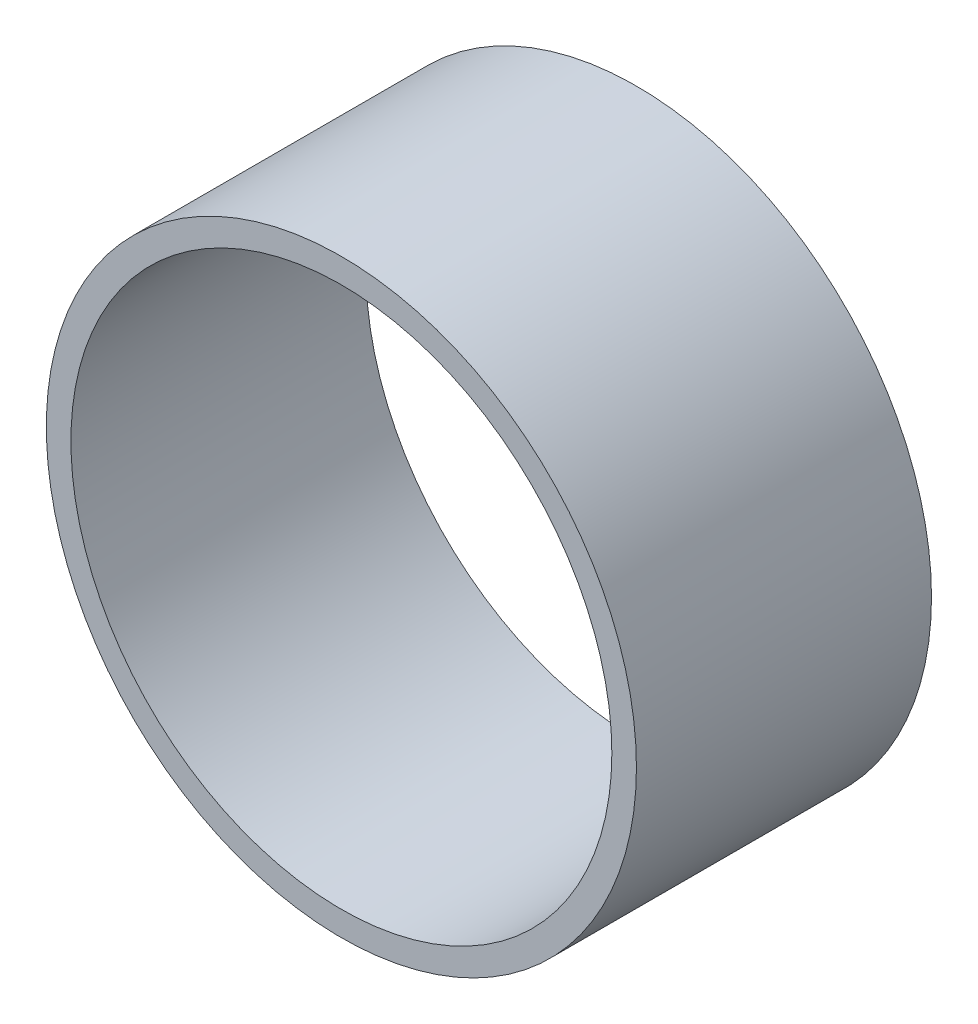
ISO-10303-21;
HEADER;
FILE_DESCRIPTION(('STEP AP214'),'2;1');
FILE_NAME('part.step','',(''),(''),'','','');
FILE_SCHEMA(('AUTOMOTIVE_DESIGN { 1 0 10303 214 1 1 1 1 }'));
ENDSEC;
DATA;
#1=APPLICATION_CONTEXT('core data for automotive mechanical design processes');
#2=APPLICATION_PROTOCOL_DEFINITION('international standard','automotive_design',2000,#1);
#3=PRODUCT_CONTEXT('',#1,'mechanical');
#4=PRODUCT('Part','Part','',(#3));
#5=PRODUCT_RELATED_PRODUCT_CATEGORY('part','',(#4));
#6=PRODUCT_DEFINITION_FORMATION('','',#4);
#7=PRODUCT_DEFINITION_CONTEXT('part definition',#1,'design');
#8=PRODUCT_DEFINITION('design','',#6,#7);
#9=PRODUCT_DEFINITION_SHAPE('','',#8);
#10=(LENGTH_UNIT() NAMED_UNIT(*) SI_UNIT(.MILLI.,.METRE.));
#11=(NAMED_UNIT(*) PLANE_ANGLE_UNIT() SI_UNIT($,.RADIAN.));
#12=(NAMED_UNIT(*) SI_UNIT($,.STERADIAN.) SOLID_ANGLE_UNIT());
#13=UNCERTAINTY_MEASURE_WITH_UNIT(LENGTH_MEASURE(1.E-05),#10,'distance_accuracy_value','');
#14=(GEOMETRIC_REPRESENTATION_CONTEXT(3) GLOBAL_UNCERTAINTY_ASSIGNED_CONTEXT((#13)) GLOBAL_UNIT_ASSIGNED_CONTEXT((#10,
#11,#12)) REPRESENTATION_CONTEXT('',''));
#15=CARTESIAN_POINT('',(0.,0.,0.));
#16=DIRECTION('',(0.,0.,1.));
#17=DIRECTION('',(1.,0.,0.));
#18=AXIS2_PLACEMENT_3D('',#15,#16,#17);
#19=CARTESIAN_POINT('',(0.,0.,12.));
#20=DIRECTION('',(0.,0.,1.));
#21=DIRECTION('',(1.,0.,0.));
#22=AXIS2_PLACEMENT_3D('',#19,#20,#21);
#23=PLANE('',#22);
#24=CARTESIAN_POINT('',(0.,0.,12.));
#25=DIRECTION('',(0.,0.,1.));
#26=DIRECTION('',(1.,0.,0.));
#27=AXIS2_PLACEMENT_3D('',#24,#25,#26);
#28=CIRCLE('',#27,12.);
#29=CARTESIAN_POINT('',(12.,0.,12.));
#30=VERTEX_POINT('',#29);
#31=EDGE_CURVE('E10',#30,#30,#28,.T.);
#32=ORIENTED_EDGE('',*,*,#31,.T.);
#33=EDGE_LOOP('',(#32));
#34=FACE_BOUND('',#33,.T.);
#35=CARTESIAN_POINT('',(0.,0.,12.));
#36=DIRECTION('',(0.,0.,1.));
#37=DIRECTION('',(1.,0.,0.));
#38=AXIS2_PLACEMENT_3D('',#35,#36,#37);
#39=CIRCLE('',#38,11.);
#40=CARTESIAN_POINT('',(11.,0.,12.));
#41=VERTEX_POINT('',#40);
#42=EDGE_CURVE('E43',#41,#41,#39,.T.);
#43=ORIENTED_EDGE('',*,*,#42,.F.);
#44=EDGE_LOOP('',(#43));
#45=FACE_BOUND('',#44,.T.);
#46=ADVANCED_FACE('F32',(#34,#45),#23,.T.);
#47=CARTESIAN_POINT('',(0.,0.,0.));
#48=DIRECTION('',(0.,0.,1.));
#49=DIRECTION('',(1.,0.,0.));
#50=AXIS2_PLACEMENT_3D('',#47,#48,#49);
#51=PLANE('',#50);
#52=CARTESIAN_POINT('',(0.,0.,0.));
#53=DIRECTION('',(0.,0.,1.));
#54=DIRECTION('',(1.,0.,0.));
#55=AXIS2_PLACEMENT_3D('',#52,#53,#54);
#56=CIRCLE('',#55,12.);
#57=CARTESIAN_POINT('',(12.,0.,0.));
#58=VERTEX_POINT('',#57);
#59=EDGE_CURVE('E36',#58,#58,#56,.T.);
#60=ORIENTED_EDGE('',*,*,#59,.F.);
#61=EDGE_LOOP('',(#60));
#62=FACE_BOUND('',#61,.T.);
#63=CARTESIAN_POINT('',(0.,0.,0.));
#64=DIRECTION('',(0.,0.,1.));
#65=DIRECTION('',(1.,0.,0.));
#66=AXIS2_PLACEMENT_3D('',#63,#64,#65);
#67=CIRCLE('',#66,11.);
#68=CARTESIAN_POINT('',(11.,0.,0.));
#69=VERTEX_POINT('',#68);
#70=EDGE_CURVE('E45',#69,#69,#67,.T.);
#71=ORIENTED_EDGE('',*,*,#70,.T.);
#72=EDGE_LOOP('',(#71));
#73=FACE_BOUND('',#72,.T.);
#74=ADVANCED_FACE('F55',(#62,#73),#51,.F.);
#75=CARTESIAN_POINT('',(0.,0.,12.));
#76=DIRECTION('',(0.,0.,-1.));
#77=DIRECTION('',(-1.,0.,0.));
#78=AXIS2_PLACEMENT_3D('',#75,#76,#77);
#79=CYLINDRICAL_SURFACE('',#78,12.);
#80=ORIENTED_EDGE('',*,*,#31,.F.);
#81=EDGE_LOOP('',(#80));
#82=FACE_BOUND('',#81,.T.);
#83=ORIENTED_EDGE('',*,*,#59,.T.);
#84=EDGE_LOOP('',(#83));
#85=FACE_BOUND('',#84,.T.);
#86=ADVANCED_FACE('F34',(#82,#85),#79,.T.);
#87=CARTESIAN_POINT('',(0.,0.,12.));
#88=DIRECTION('',(0.,0.,-1.));
#89=DIRECTION('',(-1.,0.,0.));
#90=AXIS2_PLACEMENT_3D('',#87,#88,#89);
#91=CYLINDRICAL_SURFACE('',#90,11.);
#92=ORIENTED_EDGE('',*,*,#42,.T.);
#93=EDGE_LOOP('',(#92));
#94=FACE_BOUND('',#93,.T.);
#95=ORIENTED_EDGE('',*,*,#70,.F.);
#96=EDGE_LOOP('',(#95));
#97=FACE_BOUND('',#96,.T.);
#98=ADVANCED_FACE('F51',(#94,#97),#91,.F.);
#99=CLOSED_SHELL('',(#46,#74,#86,#98));
#100=MANIFOLD_SOLID_BREP('B2',#99);
#101=ADVANCED_BREP_SHAPE_REPRESENTATION('',(#18,#100),#14);
#102=SHAPE_DEFINITION_REPRESENTATION(#9,#101);
ENDSEC;
END-ISO-10303-21;
